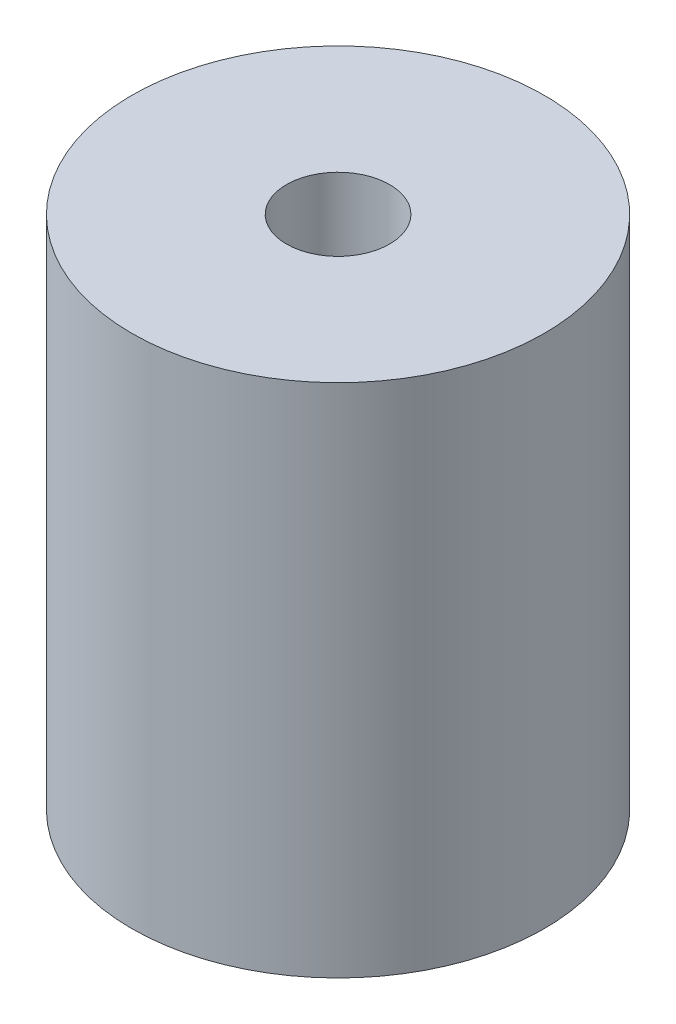
ISO-10303-21;
HEADER;
FILE_DESCRIPTION(('STEP AP214'),'2;1');
FILE_NAME('part.step','',(''),(''),'','','');
FILE_SCHEMA(('AUTOMOTIVE_DESIGN { 1 0 10303 214 1 1 1 1 }'));
ENDSEC;
DATA;
#1=APPLICATION_CONTEXT('core data for automotive mechanical design processes');
#2=APPLICATION_PROTOCOL_DEFINITION('international standard','automotive_design',2000,#1);
#3=PRODUCT_CONTEXT('',#1,'mechanical');
#4=PRODUCT('Part','Part','',(#3));
#5=PRODUCT_RELATED_PRODUCT_CATEGORY('part','',(#4));
#6=PRODUCT_DEFINITION_FORMATION('','',#4);
#7=PRODUCT_DEFINITION_CONTEXT('part definition',#1,'design');
#8=PRODUCT_DEFINITION('design','',#6,#7);
#9=PRODUCT_DEFINITION_SHAPE('','',#8);
#10=(LENGTH_UNIT() NAMED_UNIT(*) SI_UNIT(.MILLI.,.METRE.));
#11=(NAMED_UNIT(*) PLANE_ANGLE_UNIT() SI_UNIT($,.RADIAN.));
#12=(NAMED_UNIT(*) SI_UNIT($,.STERADIAN.) SOLID_ANGLE_UNIT());
#13=UNCERTAINTY_MEASURE_WITH_UNIT(LENGTH_MEASURE(1.E-05),#10,'distance_accuracy_value','');
#14=(GEOMETRIC_REPRESENTATION_CONTEXT(3) GLOBAL_UNCERTAINTY_ASSIGNED_CONTEXT((#13)) GLOBAL_UNIT_ASSIGNED_CONTEXT((#10,
#11,#12)) REPRESENTATION_CONTEXT('',''));
#15=CARTESIAN_POINT('',(0.,0.,0.));
#16=DIRECTION('',(0.,0.,1.));
#17=DIRECTION('',(1.,0.,0.));
#18=AXIS2_PLACEMENT_3D('',#15,#16,#17);
#19=CARTESIAN_POINT('',(0.,25.,0.));
#20=DIRECTION('',(0.,1.,0.));
#21=DIRECTION('',(0.,0.,1.));
#22=AXIS2_PLACEMENT_3D('',#19,#20,#21);
#23=PLANE('',#22);
#24=CARTESIAN_POINT('',(0.,25.,0.));
#25=DIRECTION('',(0.,1.,0.));
#26=DIRECTION('',(0.,0.,1.));
#27=AXIS2_PLACEMENT_3D('',#24,#25,#26);
#28=CIRCLE('',#27,10.);
#29=CARTESIAN_POINT('',(0.,25.,10.));
#30=VERTEX_POINT('',#29);
#31=EDGE_CURVE('E10',#30,#30,#28,.T.);
#32=ORIENTED_EDGE('',*,*,#31,.T.);
#33=EDGE_LOOP('',(#32));
#34=FACE_BOUND('',#33,.T.);
#35=CARTESIAN_POINT('',(0.,25.,0.));
#36=DIRECTION('',(0.,1.,0.));
#37=DIRECTION('',(0.,0.,1.));
#38=AXIS2_PLACEMENT_3D('',#35,#36,#37);
#39=CIRCLE('',#38,2.5);
#40=CARTESIAN_POINT('',(0.,25.,2.5));
#41=VERTEX_POINT('',#40);
#42=EDGE_CURVE('E50',#41,#41,#39,.T.);
#43=ORIENTED_EDGE('',*,*,#42,.F.);
#44=EDGE_LOOP('',(#43));
#45=FACE_BOUND('',#44,.T.);
#46=ADVANCED_FACE('F37',(#34,#45),#23,.T.);
#47=CARTESIAN_POINT('',(0.,0.,0.));
#48=DIRECTION('',(0.,1.,0.));
#49=DIRECTION('',(0.,0.,1.));
#50=AXIS2_PLACEMENT_3D('',#47,#48,#49);
#51=PLANE('',#50);
#52=CARTESIAN_POINT('',(0.,0.,0.));
#53=DIRECTION('',(0.,1.,0.));
#54=DIRECTION('',(0.,0.,1.));
#55=AXIS2_PLACEMENT_3D('',#52,#53,#54);
#56=CIRCLE('',#55,10.);
#57=CARTESIAN_POINT('',(0.,0.,10.));
#58=VERTEX_POINT('',#57);
#59=EDGE_CURVE('E41',#58,#58,#56,.T.);
#60=ORIENTED_EDGE('',*,*,#59,.F.);
#61=EDGE_LOOP('',(#60));
#62=FACE_BOUND('',#61,.T.);
#63=CARTESIAN_POINT('',(0.,0.,0.));
#64=DIRECTION('',(0.,1.,0.));
#65=DIRECTION('',(0.,0.,1.));
#66=AXIS2_PLACEMENT_3D('',#63,#64,#65);
#67=CIRCLE('',#66,2.5);
#68=CARTESIAN_POINT('',(0.,0.,2.5));
#69=VERTEX_POINT('',#68);
#70=EDGE_CURVE('E52',#69,#69,#67,.T.);
#71=ORIENTED_EDGE('',*,*,#70,.T.);
#72=EDGE_LOOP('',(#71));
#73=FACE_BOUND('',#72,.T.);
#74=ADVANCED_FACE('F64',(#62,#73),#51,.F.);
#75=CARTESIAN_POINT('',(0.,25.,0.));
#76=DIRECTION('',(0.,-1.,0.));
#77=DIRECTION('',(0.,0.,-1.));
#78=AXIS2_PLACEMENT_3D('',#75,#76,#77);
#79=CYLINDRICAL_SURFACE('',#78,10.);
#80=ORIENTED_EDGE('',*,*,#31,.F.);
#81=EDGE_LOOP('',(#80));
#82=FACE_BOUND('',#81,.T.);
#83=ORIENTED_EDGE('',*,*,#59,.T.);
#84=EDGE_LOOP('',(#83));
#85=FACE_BOUND('',#84,.T.);
#86=ADVANCED_FACE('F39',(#82,#85),#79,.T.);
#87=CARTESIAN_POINT('',(0.,25.,0.));
#88=DIRECTION('',(0.,-1.,0.));
#89=DIRECTION('',(0.,0.,-1.));
#90=AXIS2_PLACEMENT_3D('',#87,#88,#89);
#91=CYLINDRICAL_SURFACE('',#90,2.5);
#92=ORIENTED_EDGE('',*,*,#42,.T.);
#93=EDGE_LOOP('',(#92));
#94=FACE_BOUND('',#93,.T.);
#95=ORIENTED_EDGE('',*,*,#70,.F.);
#96=EDGE_LOOP('',(#95));
#97=FACE_BOUND('',#96,.T.);
#98=ADVANCED_FACE('F60',(#94,#97),#91,.F.);
#99=CLOSED_SHELL('',(#46,#74,#86,#98));
#100=MANIFOLD_SOLID_BREP('B2',#99);
#101=ADVANCED_BREP_SHAPE_REPRESENTATION('',(#18,#100),#14);
#102=SHAPE_DEFINITION_REPRESENTATION(#9,#101);
ENDSEC;
END-ISO-10303-21;
